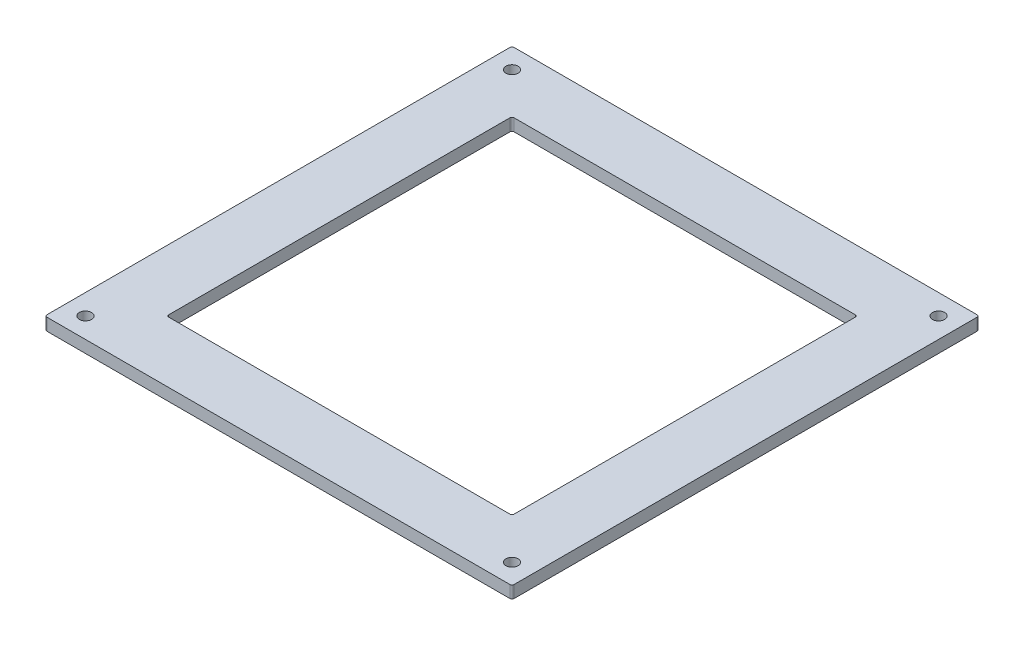
ISO-10303-21;
HEADER;
FILE_DESCRIPTION(('STEP AP214'),'2;1');
FILE_NAME('part.step','',(''),(''),'','','');
FILE_SCHEMA(('AUTOMOTIVE_DESIGN { 1 0 10303 214 1 1 1 1 }'));
ENDSEC;
DATA;
#1=APPLICATION_CONTEXT('core data for automotive mechanical design processes');
#2=APPLICATION_PROTOCOL_DEFINITION('international standard','automotive_design',2000,#1);
#3=PRODUCT_CONTEXT('',#1,'mechanical');
#4=PRODUCT('Part','Part','',(#3));
#5=PRODUCT_RELATED_PRODUCT_CATEGORY('part','',(#4));
#6=PRODUCT_DEFINITION_FORMATION('','',#4);
#7=PRODUCT_DEFINITION_CONTEXT('part definition',#1,'design');
#8=PRODUCT_DEFINITION('design','',#6,#7);
#9=PRODUCT_DEFINITION_SHAPE('','',#8);
#10=(LENGTH_UNIT() NAMED_UNIT(*) SI_UNIT(.MILLI.,.METRE.));
#11=(NAMED_UNIT(*) PLANE_ANGLE_UNIT() SI_UNIT($,.RADIAN.));
#12=(NAMED_UNIT(*) SI_UNIT($,.STERADIAN.) SOLID_ANGLE_UNIT());
#13=UNCERTAINTY_MEASURE_WITH_UNIT(LENGTH_MEASURE(1.E-05),#10,'distance_accuracy_value','');
#14=(GEOMETRIC_REPRESENTATION_CONTEXT(3) GLOBAL_UNCERTAINTY_ASSIGNED_CONTEXT((#13)) GLOBAL_UNIT_ASSIGNED_CONTEXT((#10,
#11,#12)) REPRESENTATION_CONTEXT('',''));
#15=CARTESIAN_POINT('',(0.,0.,0.));
#16=DIRECTION('',(0.,0.,1.));
#17=DIRECTION('',(1.,0.,0.));
#18=AXIS2_PLACEMENT_3D('',#15,#16,#17);
#19=CARTESIAN_POINT('',(0.,6.,-230.));
#20=DIRECTION('',(0.,-1.,0.));
#21=DIRECTION('',(0.,0.,-1.));
#22=AXIS2_PLACEMENT_3D('',#19,#20,#21);
#23=PLANE('',#22);
#24=CARTESIAN_POINT('',(9.99999999999998,6.,-10.));
#25=DIRECTION('',(0.,1.,0.));
#26=DIRECTION('',(0.,0.,1.));
#27=AXIS2_PLACEMENT_3D('',#24,#25,#26);
#28=CIRCLE('',#27,3.);
#29=CARTESIAN_POINT('',(9.99999999999998,6.,-7.00000000000001));
#30=VERTEX_POINT('',#29);
#31=EDGE_CURVE('E356',#30,#30,#28,.T.);
#32=ORIENTED_EDGE('',*,*,#31,.F.);
#33=EDGE_LOOP('',(#32));
#34=FACE_BOUND('',#33,.T.);
#35=CARTESIAN_POINT('',(220.,6.,-10.));
#36=DIRECTION('',(0.,1.,0.));
#37=DIRECTION('',(0.,0.,1.));
#38=AXIS2_PLACEMENT_3D('',#35,#36,#37);
#39=CIRCLE('',#38,2.99999999999999);
#40=CARTESIAN_POINT('',(220.,6.,-7.00000000000002));
#41=VERTEX_POINT('',#40);
#42=EDGE_CURVE('E358',#41,#41,#39,.T.);
#43=ORIENTED_EDGE('',*,*,#42,.F.);
#44=EDGE_LOOP('',(#43));
#45=FACE_BOUND('',#44,.T.);
#46=CARTESIAN_POINT('',(220.,6.,-220.));
#47=DIRECTION('',(0.,1.,0.));
#48=DIRECTION('',(0.,0.,1.));
#49=AXIS2_PLACEMENT_3D('',#46,#47,#48);
#50=CIRCLE('',#49,2.99999999999999);
#51=CARTESIAN_POINT('',(220.,6.,-217.));
#52=VERTEX_POINT('',#51);
#53=EDGE_CURVE('E364',#52,#52,#50,.T.);
#54=ORIENTED_EDGE('',*,*,#53,.F.);
#55=EDGE_LOOP('',(#54));
#56=FACE_BOUND('',#55,.T.);
#57=CARTESIAN_POINT('',(9.99999999999998,6.,-220.));
#58=DIRECTION('',(0.,1.,0.));
#59=DIRECTION('',(0.,0.,1.));
#60=AXIS2_PLACEMENT_3D('',#57,#58,#59);
#61=CIRCLE('',#60,3.);
#62=CARTESIAN_POINT('',(9.99999999999998,6.,-217.));
#63=VERTEX_POINT('',#62);
#64=EDGE_CURVE('E370',#63,#63,#61,.T.);
#65=ORIENTED_EDGE('',*,*,#64,.F.);
#66=EDGE_LOOP('',(#65));
#67=FACE_BOUND('',#66,.T.);
#68=DIRECTION('',(0.,0.,-1.));
#69=VECTOR('',#68,1.);
#70=CARTESIAN_POINT('',(230.,6.,0.));
#71=LINE('',#70,#69);
#72=CARTESIAN_POINT('',(230.,6.,-1.));
#73=VERTEX_POINT('',#72);
#74=CARTESIAN_POINT('',(230.,6.,-229.));
#75=VERTEX_POINT('',#74);
#76=EDGE_CURVE('E282',#73,#75,#71,.T.);
#77=ORIENTED_EDGE('',*,*,#76,.T.);
#78=CARTESIAN_POINT('',(229.,6.,-229.));
#79=DIRECTION('',(0.,-1.,0.));
#80=DIRECTION('',(0.,0.,-1.));
#81=AXIS2_PLACEMENT_3D('',#78,#79,#80);
#82=CIRCLE('',#81,1.);
#83=CARTESIAN_POINT('',(229.,6.,-230.));
#84=VERTEX_POINT('',#83);
#85=EDGE_CURVE('E196',#75,#84,#82,.F.);
#86=ORIENTED_EDGE('',*,*,#85,.T.);
#87=DIRECTION('',(-1.,0.,0.));
#88=VECTOR('',#87,1.);
#89=CARTESIAN_POINT('',(0.,6.,-230.));
#90=LINE('',#89,#88);
#91=CARTESIAN_POINT('',(1.,6.,-230.));
#92=VERTEX_POINT('',#91);
#93=EDGE_CURVE('E165',#84,#92,#90,.T.);
#94=ORIENTED_EDGE('',*,*,#93,.T.);
#95=CARTESIAN_POINT('',(1.,6.,-229.));
#96=DIRECTION('',(0.,-1.,0.));
#97=DIRECTION('',(0.,0.,-1.));
#98=AXIS2_PLACEMENT_3D('',#95,#96,#97);
#99=CIRCLE('',#98,1.);
#100=CARTESIAN_POINT('',(0.,6.,-229.));
#101=VERTEX_POINT('',#100);
#102=EDGE_CURVE('E192',#92,#101,#99,.F.);
#103=ORIENTED_EDGE('',*,*,#102,.T.);
#104=DIRECTION('',(0.,0.,1.));
#105=VECTOR('',#104,1.);
#106=CARTESIAN_POINT('',(0.,6.,0.));
#107=LINE('',#106,#105);
#108=CARTESIAN_POINT('',(0.,6.,-1.));
#109=VERTEX_POINT('',#108);
#110=EDGE_CURVE('E173',#101,#109,#107,.T.);
#111=ORIENTED_EDGE('',*,*,#110,.T.);
#112=CARTESIAN_POINT('',(1.,6.,-1.));
#113=DIRECTION('',(0.,-1.,0.));
#114=DIRECTION('',(0.,0.,-1.));
#115=AXIS2_PLACEMENT_3D('',#112,#113,#114);
#116=CIRCLE('',#115,1.);
#117=CARTESIAN_POINT('',(1.,6.,0.));
#118=VERTEX_POINT('',#117);
#119=EDGE_CURVE('E190',#109,#118,#116,.F.);
#120=ORIENTED_EDGE('',*,*,#119,.T.);
#121=DIRECTION('',(1.,0.,0.));
#122=VECTOR('',#121,1.);
#123=CARTESIAN_POINT('',(0.,6.,0.));
#124=LINE('',#123,#122);
#125=CARTESIAN_POINT('',(229.,6.,0.));
#126=VERTEX_POINT('',#125);
#127=EDGE_CURVE('E177',#118,#126,#124,.T.);
#128=ORIENTED_EDGE('',*,*,#127,.T.);
#129=CARTESIAN_POINT('',(229.,6.,-1.));
#130=DIRECTION('',(0.,-1.,0.));
#131=DIRECTION('',(0.,0.,-1.));
#132=AXIS2_PLACEMENT_3D('',#129,#130,#131);
#133=CIRCLE('',#132,1.);
#134=EDGE_CURVE('E194',#126,#73,#133,.F.);
#135=ORIENTED_EDGE('',*,*,#134,.T.);
#136=EDGE_LOOP('',(#77,#86,#94,#103,#111,#120,#128,#135));
#137=FACE_BOUND('',#136,.T.);
#138=DIRECTION('',(0.,0.,1.));
#139=VECTOR('',#138,1.);
#140=CARTESIAN_POINT('',(30.,6.,-30.));
#141=LINE('',#140,#139);
#142=CARTESIAN_POINT('',(30.,6.,-199.));
#143=VERTEX_POINT('',#142);
#144=CARTESIAN_POINT('',(30.,6.,-31.));
#145=VERTEX_POINT('',#144);
#146=EDGE_CURVE('E261',#143,#145,#141,.T.);
#147=ORIENTED_EDGE('',*,*,#146,.F.);
#148=CARTESIAN_POINT('',(31.,6.,-199.));
#149=DIRECTION('',(0.,-1.,0.));
#150=DIRECTION('',(0.,0.,-1.));
#151=AXIS2_PLACEMENT_3D('',#148,#149,#150);
#152=CIRCLE('',#151,1.);
#153=CARTESIAN_POINT('',(31.,6.,-200.));
#154=VERTEX_POINT('',#153);
#155=EDGE_CURVE('E11',#143,#154,#152,.T.);
#156=ORIENTED_EDGE('',*,*,#155,.T.);
#157=DIRECTION('',(-1.,0.,0.));
#158=VECTOR('',#157,1.);
#159=CARTESIAN_POINT('',(30.,6.,-200.));
#160=LINE('',#159,#158);
#161=CARTESIAN_POINT('',(199.,6.,-200.));
#162=VERTEX_POINT('',#161);
#163=EDGE_CURVE('E259',#162,#154,#160,.T.);
#164=ORIENTED_EDGE('',*,*,#163,.F.);
#165=CARTESIAN_POINT('',(199.,6.,-199.));
#166=DIRECTION('',(0.,-1.,0.));
#167=DIRECTION('',(0.,0.,-1.));
#168=AXIS2_PLACEMENT_3D('',#165,#166,#167);
#169=CIRCLE('',#168,1.);
#170=CARTESIAN_POINT('',(200.,6.,-199.));
#171=VERTEX_POINT('',#170);
#172=EDGE_CURVE('E229',#162,#171,#169,.T.);
#173=ORIENTED_EDGE('',*,*,#172,.T.);
#174=DIRECTION('',(0.,0.,-1.));
#175=VECTOR('',#174,1.);
#176=CARTESIAN_POINT('',(200.,6.,-30.));
#177=LINE('',#176,#175);
#178=CARTESIAN_POINT('',(200.,6.,-31.));
#179=VERTEX_POINT('',#178);
#180=EDGE_CURVE('E266',#179,#171,#177,.T.);
#181=ORIENTED_EDGE('',*,*,#180,.F.);
#182=CARTESIAN_POINT('',(199.,6.,-31.));
#183=DIRECTION('',(0.,-1.,0.));
#184=DIRECTION('',(0.,0.,-1.));
#185=AXIS2_PLACEMENT_3D('',#182,#183,#184);
#186=CIRCLE('',#185,1.);
#187=CARTESIAN_POINT('',(199.,6.,-30.));
#188=VERTEX_POINT('',#187);
#189=EDGE_CURVE('E46',#179,#188,#186,.T.);
#190=ORIENTED_EDGE('',*,*,#189,.T.);
#191=DIRECTION('',(1.,0.,0.));
#192=VECTOR('',#191,1.);
#193=CARTESIAN_POINT('',(30.,6.,-30.));
#194=LINE('',#193,#192);
#195=CARTESIAN_POINT('',(31.,6.,-30.));
#196=VERTEX_POINT('',#195);
#197=EDGE_CURVE('E271',#196,#188,#194,.T.);
#198=ORIENTED_EDGE('',*,*,#197,.F.);
#199=CARTESIAN_POINT('',(31.,6.,-31.));
#200=DIRECTION('',(0.,-1.,0.));
#201=DIRECTION('',(0.,0.,-1.));
#202=AXIS2_PLACEMENT_3D('',#199,#200,#201);
#203=CIRCLE('',#202,1.);
#204=EDGE_CURVE('E236',#196,#145,#203,.T.);
#205=ORIENTED_EDGE('',*,*,#204,.T.);
#206=EDGE_LOOP('',(#147,#156,#164,#173,#181,#190,#198,#205));
#207=FACE_BOUND('',#206,.T.);
#208=ADVANCED_FACE('F31',(#34,#45,#56,#67,#137,#207),#23,.F.);
#209=CARTESIAN_POINT('',(0.,0.,-230.));
#210=DIRECTION('',(0.,-1.,0.));
#211=DIRECTION('',(0.,0.,-1.));
#212=AXIS2_PLACEMENT_3D('',#209,#210,#211);
#213=PLANE('',#212);
#214=CARTESIAN_POINT('',(9.99999999999998,0.,-10.));
#215=DIRECTION('',(0.,1.,0.));
#216=DIRECTION('',(0.,0.,1.));
#217=AXIS2_PLACEMENT_3D('',#214,#215,#216);
#218=CIRCLE('',#217,3.);
#219=CARTESIAN_POINT('',(9.99999999999998,0.,-7.00000000000001));
#220=VERTEX_POINT('',#219);
#221=EDGE_CURVE('E354',#220,#220,#218,.T.);
#222=ORIENTED_EDGE('',*,*,#221,.T.);
#223=EDGE_LOOP('',(#222));
#224=FACE_BOUND('',#223,.T.);
#225=CARTESIAN_POINT('',(220.,0.,-10.));
#226=DIRECTION('',(0.,1.,0.));
#227=DIRECTION('',(0.,0.,1.));
#228=AXIS2_PLACEMENT_3D('',#225,#226,#227);
#229=CIRCLE('',#228,2.99999999999999);
#230=CARTESIAN_POINT('',(220.,0.,-7.00000000000002));
#231=VERTEX_POINT('',#230);
#232=EDGE_CURVE('E361',#231,#231,#229,.T.);
#233=ORIENTED_EDGE('',*,*,#232,.T.);
#234=EDGE_LOOP('',(#233));
#235=FACE_BOUND('',#234,.T.);
#236=CARTESIAN_POINT('',(220.,0.,-220.));
#237=DIRECTION('',(0.,1.,0.));
#238=DIRECTION('',(0.,0.,1.));
#239=AXIS2_PLACEMENT_3D('',#236,#237,#238);
#240=CIRCLE('',#239,2.99999999999999);
#241=CARTESIAN_POINT('',(220.,0.,-217.));
#242=VERTEX_POINT('',#241);
#243=EDGE_CURVE('E367',#242,#242,#240,.T.);
#244=ORIENTED_EDGE('',*,*,#243,.T.);
#245=EDGE_LOOP('',(#244));
#246=FACE_BOUND('',#245,.T.);
#247=CARTESIAN_POINT('',(9.99999999999998,0.,-220.));
#248=DIRECTION('',(0.,1.,0.));
#249=DIRECTION('',(0.,0.,1.));
#250=AXIS2_PLACEMENT_3D('',#247,#248,#249);
#251=CIRCLE('',#250,3.);
#252=CARTESIAN_POINT('',(9.99999999999998,0.,-217.));
#253=VERTEX_POINT('',#252);
#254=EDGE_CURVE('E253',#253,#253,#251,.T.);
#255=ORIENTED_EDGE('',*,*,#254,.T.);
#256=EDGE_LOOP('',(#255));
#257=FACE_BOUND('',#256,.T.);
#258=DIRECTION('',(-1.,0.,0.));
#259=VECTOR('',#258,1.);
#260=CARTESIAN_POINT('',(0.,0.,-230.));
#261=LINE('',#260,#259);
#262=CARTESIAN_POINT('',(229.,0.,-230.));
#263=VERTEX_POINT('',#262);
#264=CARTESIAN_POINT('',(1.,0.,-230.));
#265=VERTEX_POINT('',#264);
#266=EDGE_CURVE('E162',#263,#265,#261,.T.);
#267=ORIENTED_EDGE('',*,*,#266,.F.);
#268=CARTESIAN_POINT('',(229.,0.,-229.));
#269=DIRECTION('',(0.,-1.,0.));
#270=DIRECTION('',(0.,0.,-1.));
#271=AXIS2_PLACEMENT_3D('',#268,#269,#270);
#272=CIRCLE('',#271,1.);
#273=CARTESIAN_POINT('',(230.,0.,-229.));
#274=VERTEX_POINT('',#273);
#275=EDGE_CURVE('E145',#263,#274,#272,.T.);
#276=ORIENTED_EDGE('',*,*,#275,.T.);
#277=DIRECTION('',(0.,0.,-1.));
#278=VECTOR('',#277,1.);
#279=CARTESIAN_POINT('',(230.,0.,0.));
#280=LINE('',#279,#278);
#281=CARTESIAN_POINT('',(230.,0.,-1.));
#282=VERTEX_POINT('',#281);
#283=EDGE_CURVE('E174',#282,#274,#280,.T.);
#284=ORIENTED_EDGE('',*,*,#283,.F.);
#285=CARTESIAN_POINT('',(229.,0.,-1.));
#286=DIRECTION('',(0.,-1.,0.));
#287=DIRECTION('',(0.,0.,-1.));
#288=AXIS2_PLACEMENT_3D('',#285,#286,#287);
#289=CIRCLE('',#288,1.);
#290=CARTESIAN_POINT('',(229.,0.,0.));
#291=VERTEX_POINT('',#290);
#292=EDGE_CURVE('E156',#282,#291,#289,.T.);
#293=ORIENTED_EDGE('',*,*,#292,.T.);
#294=DIRECTION('',(1.,0.,0.));
#295=VECTOR('',#294,1.);
#296=CARTESIAN_POINT('',(0.,0.,0.));
#297=LINE('',#296,#295);
#298=CARTESIAN_POINT('',(1.,0.,0.));
#299=VERTEX_POINT('',#298);
#300=EDGE_CURVE('E179',#299,#291,#297,.T.);
#301=ORIENTED_EDGE('',*,*,#300,.F.);
#302=CARTESIAN_POINT('',(1.,0.,-1.));
#303=DIRECTION('',(0.,-1.,0.));
#304=DIRECTION('',(0.,0.,-1.));
#305=AXIS2_PLACEMENT_3D('',#302,#303,#304);
#306=CIRCLE('',#305,1.);
#307=CARTESIAN_POINT('',(0.,0.,-1.));
#308=VERTEX_POINT('',#307);
#309=EDGE_CURVE('E166',#299,#308,#306,.T.);
#310=ORIENTED_EDGE('',*,*,#309,.T.);
#311=DIRECTION('',(0.,0.,1.));
#312=VECTOR('',#311,1.);
#313=CARTESIAN_POINT('',(0.,0.,0.));
#314=LINE('',#313,#312);
#315=CARTESIAN_POINT('',(0.,0.,-229.));
#316=VERTEX_POINT('',#315);
#317=EDGE_CURVE('E265',#316,#308,#314,.T.);
#318=ORIENTED_EDGE('',*,*,#317,.F.);
#319=CARTESIAN_POINT('',(1.,0.,-229.));
#320=DIRECTION('',(0.,-1.,0.));
#321=DIRECTION('',(0.,0.,-1.));
#322=AXIS2_PLACEMENT_3D('',#319,#320,#321);
#323=CIRCLE('',#322,1.);
#324=EDGE_CURVE('E172',#316,#265,#323,.T.);
#325=ORIENTED_EDGE('',*,*,#324,.T.);
#326=EDGE_LOOP('',(#267,#276,#284,#293,#301,#310,#318,#325));
#327=FACE_BOUND('',#326,.T.);
#328=DIRECTION('',(0.,0.,-1.));
#329=VECTOR('',#328,1.);
#330=CARTESIAN_POINT('',(200.,0.,-30.));
#331=LINE('',#330,#329);
#332=CARTESIAN_POINT('',(200.,0.,-31.));
#333=VERTEX_POINT('',#332);
#334=CARTESIAN_POINT('',(200.,0.,-199.));
#335=VERTEX_POINT('',#334);
#336=EDGE_CURVE('E277',#333,#335,#331,.T.);
#337=ORIENTED_EDGE('',*,*,#336,.T.);
#338=CARTESIAN_POINT('',(199.,0.,-199.));
#339=DIRECTION('',(0.,-1.,0.));
#340=DIRECTION('',(0.,0.,-1.));
#341=AXIS2_PLACEMENT_3D('',#338,#339,#340);
#342=CIRCLE('',#341,1.);
#343=CARTESIAN_POINT('',(199.,0.,-200.));
#344=VERTEX_POINT('',#343);
#345=EDGE_CURVE('E227',#335,#344,#342,.F.);
#346=ORIENTED_EDGE('',*,*,#345,.T.);
#347=DIRECTION('',(-1.,0.,0.));
#348=VECTOR('',#347,1.);
#349=CARTESIAN_POINT('',(30.,0.,-200.));
#350=LINE('',#349,#348);
#351=CARTESIAN_POINT('',(31.,0.,-200.));
#352=VERTEX_POINT('',#351);
#353=EDGE_CURVE('E243',#344,#352,#350,.T.);
#354=ORIENTED_EDGE('',*,*,#353,.T.);
#355=CARTESIAN_POINT('',(31.,0.,-199.));
#356=DIRECTION('',(0.,-1.,0.));
#357=DIRECTION('',(0.,0.,-1.));
#358=AXIS2_PLACEMENT_3D('',#355,#356,#357);
#359=CIRCLE('',#358,1.);
#360=CARTESIAN_POINT('',(30.,0.,-199.));
#361=VERTEX_POINT('',#360);
#362=EDGE_CURVE('E39',#352,#361,#359,.F.);
#363=ORIENTED_EDGE('',*,*,#362,.T.);
#364=DIRECTION('',(0.,0.,1.));
#365=VECTOR('',#364,1.);
#366=CARTESIAN_POINT('',(30.,0.,-30.));
#367=LINE('',#366,#365);
#368=CARTESIAN_POINT('',(30.,0.,-31.));
#369=VERTEX_POINT('',#368);
#370=EDGE_CURVE('E241',#361,#369,#367,.T.);
#371=ORIENTED_EDGE('',*,*,#370,.T.);
#372=CARTESIAN_POINT('',(31.,0.,-31.));
#373=DIRECTION('',(0.,-1.,0.));
#374=DIRECTION('',(0.,0.,-1.));
#375=AXIS2_PLACEMENT_3D('',#372,#373,#374);
#376=CIRCLE('',#375,1.);
#377=CARTESIAN_POINT('',(31.,0.,-30.));
#378=VERTEX_POINT('',#377);
#379=EDGE_CURVE('E234',#369,#378,#376,.F.);
#380=ORIENTED_EDGE('',*,*,#379,.T.);
#381=DIRECTION('',(1.,0.,0.));
#382=VECTOR('',#381,1.);
#383=CARTESIAN_POINT('',(30.,0.,-30.));
#384=LINE('',#383,#382);
#385=CARTESIAN_POINT('',(199.,0.,-30.));
#386=VERTEX_POINT('',#385);
#387=EDGE_CURVE('E252',#378,#386,#384,.T.);
#388=ORIENTED_EDGE('',*,*,#387,.T.);
#389=CARTESIAN_POINT('',(199.,0.,-31.));
#390=DIRECTION('',(0.,-1.,0.));
#391=DIRECTION('',(0.,0.,-1.));
#392=AXIS2_PLACEMENT_3D('',#389,#390,#391);
#393=CIRCLE('',#392,1.);
#394=EDGE_CURVE('E231',#386,#333,#393,.F.);
#395=ORIENTED_EDGE('',*,*,#394,.T.);
#396=EDGE_LOOP('',(#337,#346,#354,#363,#371,#380,#388,#395));
#397=FACE_BOUND('',#396,.T.);
#398=ADVANCED_FACE('F169',(#224,#235,#246,#257,#327,#397),#213,.T.);
#399=CARTESIAN_POINT('',(0.,6.,0.));
#400=DIRECTION('',(1.,0.,0.));
#401=DIRECTION('',(0.,0.,-1.));
#402=AXIS2_PLACEMENT_3D('',#399,#400,#401);
#403=PLANE('',#402);
#404=ORIENTED_EDGE('',*,*,#110,.F.);
#405=DIRECTION('',(0.,-1.,0.));
#406=VECTOR('',#405,1.);
#407=CARTESIAN_POINT('',(0.,6.,-229.));
#408=LINE('',#407,#406);
#409=EDGE_CURVE('E224',#101,#316,#408,.T.);
#410=ORIENTED_EDGE('',*,*,#409,.T.);
#411=ORIENTED_EDGE('',*,*,#317,.T.);
#412=DIRECTION('',(0.,-1.,0.));
#413=VECTOR('',#412,1.);
#414=CARTESIAN_POINT('',(0.,6.,-1.));
#415=LINE('',#414,#413);
#416=EDGE_CURVE('E222',#308,#109,#415,.F.);
#417=ORIENTED_EDGE('',*,*,#416,.T.);
#418=EDGE_LOOP('',(#404,#410,#411,#417));
#419=FACE_BOUND('',#418,.T.);
#420=ADVANCED_FACE('F307',(#419),#403,.F.);
#421=CARTESIAN_POINT('',(0.,6.,0.));
#422=DIRECTION('',(0.,0.,-1.));
#423=DIRECTION('',(-1.,0.,0.));
#424=AXIS2_PLACEMENT_3D('',#421,#422,#423);
#425=PLANE('',#424);
#426=ORIENTED_EDGE('',*,*,#300,.T.);
#427=DIRECTION('',(0.,-1.,0.));
#428=VECTOR('',#427,1.);
#429=CARTESIAN_POINT('',(229.,6.,0.));
#430=LINE('',#429,#428);
#431=EDGE_CURVE('E215',#291,#126,#430,.F.);
#432=ORIENTED_EDGE('',*,*,#431,.T.);
#433=ORIENTED_EDGE('',*,*,#127,.F.);
#434=DIRECTION('',(0.,-1.,0.));
#435=VECTOR('',#434,1.);
#436=CARTESIAN_POINT('',(1.,6.,0.));
#437=LINE('',#436,#435);
#438=EDGE_CURVE('E212',#118,#299,#437,.T.);
#439=ORIENTED_EDGE('',*,*,#438,.T.);
#440=EDGE_LOOP('',(#426,#432,#433,#439));
#441=FACE_BOUND('',#440,.T.);
#442=ADVANCED_FACE('F289',(#441),#425,.F.);
#443=CARTESIAN_POINT('',(230.,6.,0.));
#444=DIRECTION('',(-1.,0.,0.));
#445=DIRECTION('',(0.,0.,1.));
#446=AXIS2_PLACEMENT_3D('',#443,#444,#445);
#447=PLANE('',#446);
#448=ORIENTED_EDGE('',*,*,#283,.T.);
#449=DIRECTION('',(0.,-1.,0.));
#450=VECTOR('',#449,1.);
#451=CARTESIAN_POINT('',(230.,6.,-229.));
#452=LINE('',#451,#450);
#453=EDGE_CURVE('E150',#274,#75,#452,.F.);
#454=ORIENTED_EDGE('',*,*,#453,.T.);
#455=ORIENTED_EDGE('',*,*,#76,.F.);
#456=DIRECTION('',(0.,-1.,0.));
#457=VECTOR('',#456,1.);
#458=CARTESIAN_POINT('',(230.,6.,-1.));
#459=LINE('',#458,#457);
#460=EDGE_CURVE('E155',#73,#282,#459,.T.);
#461=ORIENTED_EDGE('',*,*,#460,.T.);
#462=EDGE_LOOP('',(#448,#454,#455,#461));
#463=FACE_BOUND('',#462,.T.);
#464=ADVANCED_FACE('F299',(#463),#447,.F.);
#465=CARTESIAN_POINT('',(0.,6.,-230.));
#466=DIRECTION('',(0.,0.,1.));
#467=DIRECTION('',(1.,0.,0.));
#468=AXIS2_PLACEMENT_3D('',#465,#466,#467);
#469=PLANE('',#468);
#470=ORIENTED_EDGE('',*,*,#93,.F.);
#471=DIRECTION('',(0.,-1.,0.));
#472=VECTOR('',#471,1.);
#473=CARTESIAN_POINT('',(229.,6.,-230.));
#474=LINE('',#473,#472);
#475=EDGE_CURVE('E149',#84,#263,#474,.T.);
#476=ORIENTED_EDGE('',*,*,#475,.T.);
#477=ORIENTED_EDGE('',*,*,#266,.T.);
#478=DIRECTION('',(0.,-1.,0.));
#479=VECTOR('',#478,1.);
#480=CARTESIAN_POINT('',(1.,6.,-230.));
#481=LINE('',#480,#479);
#482=EDGE_CURVE('E167',#265,#92,#481,.F.);
#483=ORIENTED_EDGE('',*,*,#482,.T.);
#484=EDGE_LOOP('',(#470,#476,#477,#483));
#485=FACE_BOUND('',#484,.T.);
#486=ADVANCED_FACE('F161',(#485),#469,.F.);
#487=CARTESIAN_POINT('',(30.,6.,-30.));
#488=DIRECTION('',(1.,0.,0.));
#489=DIRECTION('',(0.,0.,-1.));
#490=AXIS2_PLACEMENT_3D('',#487,#488,#489);
#491=PLANE('',#490);
#492=ORIENTED_EDGE('',*,*,#146,.T.);
#493=DIRECTION('',(0.,-1.,0.));
#494=VECTOR('',#493,1.);
#495=CARTESIAN_POINT('',(30.,0.,-31.));
#496=LINE('',#495,#494);
#497=EDGE_CURVE('E219',#145,#369,#496,.T.);
#498=ORIENTED_EDGE('',*,*,#497,.T.);
#499=ORIENTED_EDGE('',*,*,#370,.F.);
#500=DIRECTION('',(0.,-1.,0.));
#501=VECTOR('',#500,1.);
#502=CARTESIAN_POINT('',(30.,6.,-199.));
#503=LINE('',#502,#501);
#504=EDGE_CURVE('E217',#361,#143,#503,.F.);
#505=ORIENTED_EDGE('',*,*,#504,.T.);
#506=EDGE_LOOP('',(#492,#498,#499,#505));
#507=FACE_BOUND('',#506,.T.);
#508=ADVANCED_FACE('F249',(#507),#491,.T.);
#509=CARTESIAN_POINT('',(30.,6.,-30.));
#510=DIRECTION('',(0.,0.,-1.));
#511=DIRECTION('',(-1.,0.,0.));
#512=AXIS2_PLACEMENT_3D('',#509,#510,#511);
#513=PLANE('',#512);
#514=ORIENTED_EDGE('',*,*,#197,.T.);
#515=DIRECTION('',(0.,-1.,0.));
#516=VECTOR('',#515,1.);
#517=CARTESIAN_POINT('',(199.,0.,-30.));
#518=LINE('',#517,#516);
#519=EDGE_CURVE('E209',#188,#386,#518,.T.);
#520=ORIENTED_EDGE('',*,*,#519,.T.);
#521=ORIENTED_EDGE('',*,*,#387,.F.);
#522=DIRECTION('',(0.,-1.,0.));
#523=VECTOR('',#522,1.);
#524=CARTESIAN_POINT('',(31.,6.,-30.));
#525=LINE('',#524,#523);
#526=EDGE_CURVE('E53',#378,#196,#525,.F.);
#527=ORIENTED_EDGE('',*,*,#526,.T.);
#528=EDGE_LOOP('',(#514,#520,#521,#527));
#529=FACE_BOUND('',#528,.T.);
#530=ADVANCED_FACE('F322',(#529),#513,.T.);
#531=CARTESIAN_POINT('',(200.,6.,-30.));
#532=DIRECTION('',(-1.,0.,0.));
#533=DIRECTION('',(0.,0.,1.));
#534=AXIS2_PLACEMENT_3D('',#531,#532,#533);
#535=PLANE('',#534);
#536=ORIENTED_EDGE('',*,*,#180,.T.);
#537=DIRECTION('',(0.,-1.,0.));
#538=VECTOR('',#537,1.);
#539=CARTESIAN_POINT('',(200.,0.,-199.));
#540=LINE('',#539,#538);
#541=EDGE_CURVE('E200',#171,#335,#540,.T.);
#542=ORIENTED_EDGE('',*,*,#541,.T.);
#543=ORIENTED_EDGE('',*,*,#336,.F.);
#544=DIRECTION('',(0.,-1.,0.));
#545=VECTOR('',#544,1.);
#546=CARTESIAN_POINT('',(200.,6.,-31.));
#547=LINE('',#546,#545);
#548=EDGE_CURVE('E198',#333,#179,#547,.F.);
#549=ORIENTED_EDGE('',*,*,#548,.T.);
#550=EDGE_LOOP('',(#536,#542,#543,#549));
#551=FACE_BOUND('',#550,.T.);
#552=ADVANCED_FACE('F325',(#551),#535,.T.);
#553=CARTESIAN_POINT('',(30.,6.,-200.));
#554=DIRECTION('',(0.,0.,1.));
#555=DIRECTION('',(1.,0.,0.));
#556=AXIS2_PLACEMENT_3D('',#553,#554,#555);
#557=PLANE('',#556);
#558=ORIENTED_EDGE('',*,*,#353,.F.);
#559=DIRECTION('',(0.,-1.,0.));
#560=VECTOR('',#559,1.);
#561=CARTESIAN_POINT('',(199.,6.,-200.));
#562=LINE('',#561,#560);
#563=EDGE_CURVE('E206',#344,#162,#562,.F.);
#564=ORIENTED_EDGE('',*,*,#563,.T.);
#565=ORIENTED_EDGE('',*,*,#163,.T.);
#566=DIRECTION('',(0.,-1.,0.));
#567=VECTOR('',#566,1.);
#568=CARTESIAN_POINT('',(31.,0.,-200.));
#569=LINE('',#568,#567);
#570=EDGE_CURVE('E203',#154,#352,#569,.T.);
#571=ORIENTED_EDGE('',*,*,#570,.T.);
#572=EDGE_LOOP('',(#558,#564,#565,#571));
#573=FACE_BOUND('',#572,.T.);
#574=ADVANCED_FACE('F263',(#573),#557,.T.);
#575=CARTESIAN_POINT('',(9.99999999999998,0.,-220.));
#576=DIRECTION('',(0.,1.,0.));
#577=DIRECTION('',(0.,0.,1.));
#578=AXIS2_PLACEMENT_3D('',#575,#576,#577);
#579=CYLINDRICAL_SURFACE('',#578,3.);
#580=ORIENTED_EDGE('',*,*,#254,.F.);
#581=EDGE_LOOP('',(#580));
#582=FACE_BOUND('',#581,.T.);
#583=ORIENTED_EDGE('',*,*,#64,.T.);
#584=EDGE_LOOP('',(#583));
#585=FACE_BOUND('',#584,.T.);
#586=ADVANCED_FACE('F331',(#582,#585),#579,.F.);
#587=CARTESIAN_POINT('',(220.,0.,-220.));
#588=DIRECTION('',(0.,1.,0.));
#589=DIRECTION('',(0.,0.,1.));
#590=AXIS2_PLACEMENT_3D('',#587,#588,#589);
#591=CYLINDRICAL_SURFACE('',#590,2.99999999999999);
#592=ORIENTED_EDGE('',*,*,#243,.F.);
#593=EDGE_LOOP('',(#592));
#594=FACE_BOUND('',#593,.T.);
#595=ORIENTED_EDGE('',*,*,#53,.T.);
#596=EDGE_LOOP('',(#595));
#597=FACE_BOUND('',#596,.T.);
#598=ADVANCED_FACE('F334',(#594,#597),#591,.F.);
#599=CARTESIAN_POINT('',(220.,0.,-10.));
#600=DIRECTION('',(0.,1.,0.));
#601=DIRECTION('',(0.,0.,1.));
#602=AXIS2_PLACEMENT_3D('',#599,#600,#601);
#603=CYLINDRICAL_SURFACE('',#602,2.99999999999999);
#604=ORIENTED_EDGE('',*,*,#232,.F.);
#605=EDGE_LOOP('',(#604));
#606=FACE_BOUND('',#605,.T.);
#607=ORIENTED_EDGE('',*,*,#42,.T.);
#608=EDGE_LOOP('',(#607));
#609=FACE_BOUND('',#608,.T.);
#610=ADVANCED_FACE('F338',(#606,#609),#603,.F.);
#611=CARTESIAN_POINT('',(9.99999999999998,0.,-10.));
#612=DIRECTION('',(0.,1.,0.));
#613=DIRECTION('',(0.,0.,1.));
#614=AXIS2_PLACEMENT_3D('',#611,#612,#613);
#615=CYLINDRICAL_SURFACE('',#614,3.);
#616=ORIENTED_EDGE('',*,*,#221,.F.);
#617=EDGE_LOOP('',(#616));
#618=FACE_BOUND('',#617,.T.);
#619=ORIENTED_EDGE('',*,*,#31,.T.);
#620=EDGE_LOOP('',(#619));
#621=FACE_BOUND('',#620,.T.);
#622=ADVANCED_FACE('F342',(#618,#621),#615,.F.);
#623=CARTESIAN_POINT('',(229.,6.,-229.));
#624=DIRECTION('',(0.,-1.,0.));
#625=DIRECTION('',(0.,0.,-1.));
#626=AXIS2_PLACEMENT_3D('',#623,#624,#625);
#627=CYLINDRICAL_SURFACE('',#626,1.);
#628=ORIENTED_EDGE('',*,*,#85,.F.);
#629=ORIENTED_EDGE('',*,*,#453,.F.);
#630=ORIENTED_EDGE('',*,*,#275,.F.);
#631=ORIENTED_EDGE('',*,*,#475,.F.);
#632=EDGE_LOOP('',(#628,#629,#630,#631));
#633=FACE_BOUND('',#632,.T.);
#634=ADVANCED_FACE('F148',(#633),#627,.T.);
#635=CARTESIAN_POINT('',(199.,6.,-199.));
#636=DIRECTION('',(0.,1.,0.));
#637=DIRECTION('',(0.,0.,1.));
#638=AXIS2_PLACEMENT_3D('',#635,#636,#637);
#639=CYLINDRICAL_SURFACE('',#638,1.);
#640=ORIENTED_EDGE('',*,*,#172,.F.);
#641=ORIENTED_EDGE('',*,*,#563,.F.);
#642=ORIENTED_EDGE('',*,*,#345,.F.);
#643=ORIENTED_EDGE('',*,*,#541,.F.);
#644=EDGE_LOOP('',(#640,#641,#642,#643));
#645=FACE_BOUND('',#644,.T.);
#646=ADVANCED_FACE('F349',(#645),#639,.F.);
#647=CARTESIAN_POINT('',(199.,6.,-31.));
#648=DIRECTION('',(0.,1.,0.));
#649=DIRECTION('',(0.,0.,1.));
#650=AXIS2_PLACEMENT_3D('',#647,#648,#649);
#651=CYLINDRICAL_SURFACE('',#650,1.);
#652=ORIENTED_EDGE('',*,*,#189,.F.);
#653=ORIENTED_EDGE('',*,*,#548,.F.);
#654=ORIENTED_EDGE('',*,*,#394,.F.);
#655=ORIENTED_EDGE('',*,*,#519,.F.);
#656=EDGE_LOOP('',(#652,#653,#654,#655));
#657=FACE_BOUND('',#656,.T.);
#658=ADVANCED_FACE('F380',(#657),#651,.F.);
#659=CARTESIAN_POINT('',(229.,6.,-1.));
#660=DIRECTION('',(0.,-1.,0.));
#661=DIRECTION('',(0.,0.,-1.));
#662=AXIS2_PLACEMENT_3D('',#659,#660,#661);
#663=CYLINDRICAL_SURFACE('',#662,1.);
#664=ORIENTED_EDGE('',*,*,#134,.F.);
#665=ORIENTED_EDGE('',*,*,#431,.F.);
#666=ORIENTED_EDGE('',*,*,#292,.F.);
#667=ORIENTED_EDGE('',*,*,#460,.F.);
#668=EDGE_LOOP('',(#664,#665,#666,#667));
#669=FACE_BOUND('',#668,.T.);
#670=ADVANCED_FACE('F294',(#669),#663,.T.);
#671=CARTESIAN_POINT('',(31.,6.,-31.));
#672=DIRECTION('',(0.,1.,0.));
#673=DIRECTION('',(0.,0.,1.));
#674=AXIS2_PLACEMENT_3D('',#671,#672,#673);
#675=CYLINDRICAL_SURFACE('',#674,1.);
#676=ORIENTED_EDGE('',*,*,#204,.F.);
#677=ORIENTED_EDGE('',*,*,#526,.F.);
#678=ORIENTED_EDGE('',*,*,#379,.F.);
#679=ORIENTED_EDGE('',*,*,#497,.F.);
#680=EDGE_LOOP('',(#676,#677,#678,#679));
#681=FACE_BOUND('',#680,.T.);
#682=ADVANCED_FACE('F395',(#681),#675,.F.);
#683=CARTESIAN_POINT('',(31.,6.,-199.));
#684=DIRECTION('',(0.,1.,0.));
#685=DIRECTION('',(0.,0.,1.));
#686=AXIS2_PLACEMENT_3D('',#683,#684,#685);
#687=CYLINDRICAL_SURFACE('',#686,1.);
#688=ORIENTED_EDGE('',*,*,#155,.F.);
#689=ORIENTED_EDGE('',*,*,#504,.F.);
#690=ORIENTED_EDGE('',*,*,#362,.F.);
#691=ORIENTED_EDGE('',*,*,#570,.F.);
#692=EDGE_LOOP('',(#688,#689,#690,#691));
#693=FACE_BOUND('',#692,.T.);
#694=ADVANCED_FACE('F256',(#693),#687,.F.);
#695=CARTESIAN_POINT('',(1.,6.,-229.));
#696=DIRECTION('',(0.,-1.,0.));
#697=DIRECTION('',(0.,0.,-1.));
#698=AXIS2_PLACEMENT_3D('',#695,#696,#697);
#699=CYLINDRICAL_SURFACE('',#698,1.);
#700=ORIENTED_EDGE('',*,*,#102,.F.);
#701=ORIENTED_EDGE('',*,*,#482,.F.);
#702=ORIENTED_EDGE('',*,*,#324,.F.);
#703=ORIENTED_EDGE('',*,*,#409,.F.);
#704=EDGE_LOOP('',(#700,#701,#702,#703));
#705=FACE_BOUND('',#704,.T.);
#706=ADVANCED_FACE('F400',(#705),#699,.T.);
#707=CARTESIAN_POINT('',(1.,6.,-1.));
#708=DIRECTION('',(0.,-1.,0.));
#709=DIRECTION('',(0.,0.,-1.));
#710=AXIS2_PLACEMENT_3D('',#707,#708,#709);
#711=CYLINDRICAL_SURFACE('',#710,1.);
#712=ORIENTED_EDGE('',*,*,#119,.F.);
#713=ORIENTED_EDGE('',*,*,#416,.F.);
#714=ORIENTED_EDGE('',*,*,#309,.F.);
#715=ORIENTED_EDGE('',*,*,#438,.F.);
#716=EDGE_LOOP('',(#712,#713,#714,#715));
#717=FACE_BOUND('',#716,.T.);
#718=ADVANCED_FACE('F33',(#717),#711,.T.);
#719=CLOSED_SHELL('',(#208,#398,#420,#442,#464,#486,#508,#530,#552,#574,#586,#598,#610,#622,
#634,#646,#658,#670,#682,#694,#706,#718));
#720=MANIFOLD_SOLID_BREP('B2',#719);
#721=ADVANCED_BREP_SHAPE_REPRESENTATION('',(#18,#720),#14);
#722=SHAPE_DEFINITION_REPRESENTATION(#9,#721);
ENDSEC;
END-ISO-10303-21;
